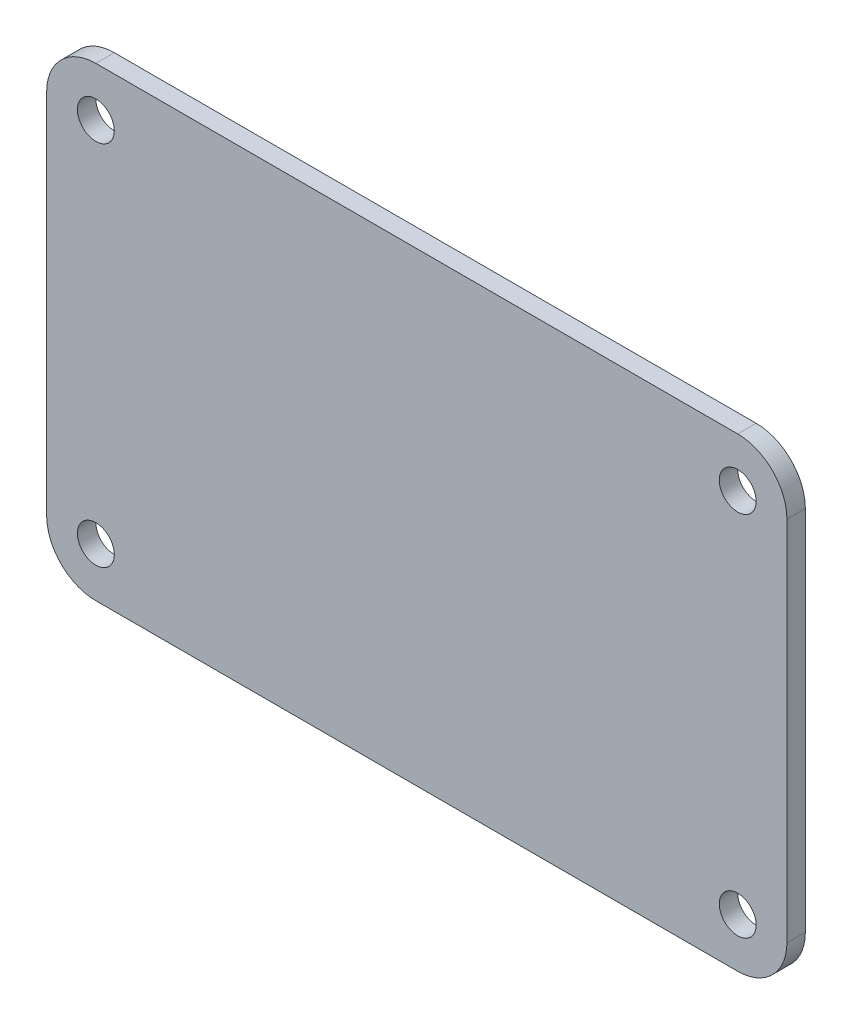
ISO-10303-21;
HEADER;
FILE_DESCRIPTION(('STEP AP214'),'2;1');
FILE_NAME('part.step','',(''),(''),'','','');
FILE_SCHEMA(('AUTOMOTIVE_DESIGN { 1 0 10303 214 1 1 1 1 }'));
ENDSEC;
DATA;
#1=APPLICATION_CONTEXT('core data for automotive mechanical design processes');
#2=APPLICATION_PROTOCOL_DEFINITION('international standard','automotive_design',2000,#1);
#3=PRODUCT_CONTEXT('',#1,'mechanical');
#4=PRODUCT('Part','Part','',(#3));
#5=PRODUCT_RELATED_PRODUCT_CATEGORY('part','',(#4));
#6=PRODUCT_DEFINITION_FORMATION('','',#4);
#7=PRODUCT_DEFINITION_CONTEXT('part definition',#1,'design');
#8=PRODUCT_DEFINITION('design','',#6,#7);
#9=PRODUCT_DEFINITION_SHAPE('','',#8);
#10=(LENGTH_UNIT() NAMED_UNIT(*) SI_UNIT(.MILLI.,.METRE.));
#11=(NAMED_UNIT(*) PLANE_ANGLE_UNIT() SI_UNIT($,.RADIAN.));
#12=(NAMED_UNIT(*) SI_UNIT($,.STERADIAN.) SOLID_ANGLE_UNIT());
#13=UNCERTAINTY_MEASURE_WITH_UNIT(LENGTH_MEASURE(1.E-05),#10,'distance_accuracy_value','');
#14=(GEOMETRIC_REPRESENTATION_CONTEXT(3) GLOBAL_UNCERTAINTY_ASSIGNED_CONTEXT((#13)) GLOBAL_UNIT_ASSIGNED_CONTEXT((#10,
#11,#12)) REPRESENTATION_CONTEXT('',''));
#15=CARTESIAN_POINT('',(0.,0.,0.));
#16=DIRECTION('',(0.,0.,1.));
#17=DIRECTION('',(1.,0.,0.));
#18=AXIS2_PLACEMENT_3D('',#15,#16,#17);
#19=CARTESIAN_POINT('',(26.095,-14.92,1.5));
#20=DIRECTION('',(0.,0.,1.));
#21=DIRECTION('',(1.,0.,0.));
#22=AXIS2_PLACEMENT_3D('',#19,#20,#21);
#23=PLANE('',#22);
#24=CARTESIAN_POINT('',(26.095,14.92,1.5));
#25=DIRECTION('',(0.,0.,1.));
#26=DIRECTION('',(1.,0.,0.));
#27=AXIS2_PLACEMENT_3D('',#24,#25,#26);
#28=CIRCLE('',#27,1.5);
#29=CARTESIAN_POINT('',(27.595,14.92,1.5));
#30=VERTEX_POINT('',#29);
#31=EDGE_CURVE('E188',#30,#30,#28,.T.);
#32=ORIENTED_EDGE('',*,*,#31,.F.);
#33=EDGE_LOOP('',(#32));
#34=FACE_BOUND('',#33,.T.);
#35=CARTESIAN_POINT('',(-26.095,14.92,1.5));
#36=DIRECTION('',(0.,0.,1.));
#37=DIRECTION('',(1.,0.,0.));
#38=AXIS2_PLACEMENT_3D('',#35,#36,#37);
#39=CIRCLE('',#38,1.5);
#40=CARTESIAN_POINT('',(-24.595,14.92,1.5));
#41=VERTEX_POINT('',#40);
#42=EDGE_CURVE('E134',#41,#41,#39,.T.);
#43=ORIENTED_EDGE('',*,*,#42,.F.);
#44=EDGE_LOOP('',(#43));
#45=FACE_BOUND('',#44,.T.);
#46=CARTESIAN_POINT('',(26.095,-14.92,1.5));
#47=DIRECTION('',(0.,0.,1.));
#48=DIRECTION('',(1.,0.,0.));
#49=AXIS2_PLACEMENT_3D('',#46,#47,#48);
#50=CIRCLE('',#49,4.);
#51=CARTESIAN_POINT('',(26.095,-18.92,1.5));
#52=VERTEX_POINT('',#51);
#53=CARTESIAN_POINT('',(30.095,-14.92,1.5));
#54=VERTEX_POINT('',#53);
#55=EDGE_CURVE('E145',#52,#54,#50,.T.);
#56=ORIENTED_EDGE('',*,*,#55,.T.);
#57=DIRECTION('',(0.,1.,0.));
#58=VECTOR('',#57,1.);
#59=CARTESIAN_POINT('',(30.095,14.92,1.5));
#60=LINE('',#59,#58);
#61=CARTESIAN_POINT('',(30.095,14.92,1.5));
#62=VERTEX_POINT('',#61);
#63=EDGE_CURVE('E93',#54,#62,#60,.T.);
#64=ORIENTED_EDGE('',*,*,#63,.T.);
#65=CARTESIAN_POINT('',(26.095,14.92,1.5));
#66=DIRECTION('',(0.,0.,1.));
#67=DIRECTION('',(-1.,0.,0.));
#68=AXIS2_PLACEMENT_3D('',#65,#66,#67);
#69=CIRCLE('',#68,4.);
#70=CARTESIAN_POINT('',(26.095,18.92,1.5));
#71=VERTEX_POINT('',#70);
#72=EDGE_CURVE('E160',#62,#71,#69,.T.);
#73=ORIENTED_EDGE('',*,*,#72,.T.);
#74=DIRECTION('',(-1.,0.,0.));
#75=VECTOR('',#74,1.);
#76=CARTESIAN_POINT('',(-26.095,18.92,1.5));
#77=LINE('',#76,#75);
#78=CARTESIAN_POINT('',(-26.095,18.92,1.5));
#79=VERTEX_POINT('',#78);
#80=EDGE_CURVE('E173',#71,#79,#77,.T.);
#81=ORIENTED_EDGE('',*,*,#80,.T.);
#82=CARTESIAN_POINT('',(-26.095,14.92,1.5));
#83=DIRECTION('',(0.,0.,1.));
#84=DIRECTION('',(1.,0.,0.));
#85=AXIS2_PLACEMENT_3D('',#82,#83,#84);
#86=CIRCLE('',#85,4.);
#87=CARTESIAN_POINT('',(-30.095,14.92,1.5));
#88=VERTEX_POINT('',#87);
#89=EDGE_CURVE('E112',#79,#88,#86,.T.);
#90=ORIENTED_EDGE('',*,*,#89,.T.);
#91=DIRECTION('',(0.,-1.,0.));
#92=VECTOR('',#91,1.);
#93=CARTESIAN_POINT('',(-30.095,14.92,1.5));
#94=LINE('',#93,#92);
#95=CARTESIAN_POINT('',(-30.095,-14.92,1.5));
#96=VERTEX_POINT('',#95);
#97=EDGE_CURVE('E106',#88,#96,#94,.T.);
#98=ORIENTED_EDGE('',*,*,#97,.T.);
#99=CARTESIAN_POINT('',(-26.095,-14.92,1.5));
#100=DIRECTION('',(0.,0.,1.));
#101=DIRECTION('',(1.,0.,0.));
#102=AXIS2_PLACEMENT_3D('',#99,#100,#101);
#103=CIRCLE('',#102,4.);
#104=CARTESIAN_POINT('',(-26.095,-18.92,1.5));
#105=VERTEX_POINT('',#104);
#106=EDGE_CURVE('E110',#96,#105,#103,.T.);
#107=ORIENTED_EDGE('',*,*,#106,.T.);
#108=DIRECTION('',(1.,0.,0.));
#109=VECTOR('',#108,1.);
#110=CARTESIAN_POINT('',(-26.095,-18.92,1.5));
#111=LINE('',#110,#109);
#112=EDGE_CURVE('E50',#105,#52,#111,.T.);
#113=ORIENTED_EDGE('',*,*,#112,.T.);
#114=EDGE_LOOP('',(#56,#64,#73,#81,#90,#98,#107,#113));
#115=FACE_BOUND('',#114,.T.);
#116=CARTESIAN_POINT('',(-26.095,-14.92,1.5));
#117=DIRECTION('',(0.,0.,1.));
#118=DIRECTION('',(1.,0.,0.));
#119=AXIS2_PLACEMENT_3D('',#116,#117,#118);
#120=CIRCLE('',#119,1.5);
#121=CARTESIAN_POINT('',(-24.595,-14.92,1.5));
#122=VERTEX_POINT('',#121);
#123=EDGE_CURVE('E182',#122,#122,#120,.T.);
#124=ORIENTED_EDGE('',*,*,#123,.F.);
#125=EDGE_LOOP('',(#124));
#126=FACE_BOUND('',#125,.T.);
#127=CARTESIAN_POINT('',(26.095,-14.92,1.5));
#128=DIRECTION('',(0.,0.,1.));
#129=DIRECTION('',(1.,0.,0.));
#130=AXIS2_PLACEMENT_3D('',#127,#128,#129);
#131=CIRCLE('',#130,1.5);
#132=CARTESIAN_POINT('',(27.595,-14.92,1.5));
#133=VERTEX_POINT('',#132);
#134=EDGE_CURVE('E194',#133,#133,#131,.T.);
#135=ORIENTED_EDGE('',*,*,#134,.F.);
#136=EDGE_LOOP('',(#135));
#137=FACE_BOUND('',#136,.T.);
#138=ADVANCED_FACE('F33',(#34,#45,#115,#126,#137),#23,.T.);
#139=CARTESIAN_POINT('',(26.095,-14.92,0.));
#140=DIRECTION('',(0.,0.,1.));
#141=DIRECTION('',(1.,0.,0.));
#142=AXIS2_PLACEMENT_3D('',#139,#140,#141);
#143=PLANE('',#142);
#144=CARTESIAN_POINT('',(26.095,-14.92,0.));
#145=DIRECTION('',(0.,0.,1.));
#146=DIRECTION('',(1.,0.,0.));
#147=AXIS2_PLACEMENT_3D('',#144,#145,#146);
#148=CIRCLE('',#147,4.);
#149=CARTESIAN_POINT('',(26.095,-18.92,0.));
#150=VERTEX_POINT('',#149);
#151=CARTESIAN_POINT('',(30.095,-14.92,0.));
#152=VERTEX_POINT('',#151);
#153=EDGE_CURVE('E130',#150,#152,#148,.T.);
#154=ORIENTED_EDGE('',*,*,#153,.F.);
#155=DIRECTION('',(1.,0.,0.));
#156=VECTOR('',#155,1.);
#157=CARTESIAN_POINT('',(-26.095,-18.92,0.));
#158=LINE('',#157,#156);
#159=CARTESIAN_POINT('',(-26.095,-18.92,0.));
#160=VERTEX_POINT('',#159);
#161=EDGE_CURVE('E85',#160,#150,#158,.T.);
#162=ORIENTED_EDGE('',*,*,#161,.F.);
#163=CARTESIAN_POINT('',(-26.095,-14.92,0.));
#164=DIRECTION('',(0.,0.,1.));
#165=DIRECTION('',(1.,0.,0.));
#166=AXIS2_PLACEMENT_3D('',#163,#164,#165);
#167=CIRCLE('',#166,4.);
#168=CARTESIAN_POINT('',(-30.095,-14.92,0.));
#169=VERTEX_POINT('',#168);
#170=EDGE_CURVE('E79',#169,#160,#167,.T.);
#171=ORIENTED_EDGE('',*,*,#170,.F.);
#172=DIRECTION('',(0.,-1.,0.));
#173=VECTOR('',#172,1.);
#174=CARTESIAN_POINT('',(-30.095,14.92,0.));
#175=LINE('',#174,#173);
#176=CARTESIAN_POINT('',(-30.095,14.92,0.));
#177=VERTEX_POINT('',#176);
#178=EDGE_CURVE('E120',#177,#169,#175,.T.);
#179=ORIENTED_EDGE('',*,*,#178,.F.);
#180=CARTESIAN_POINT('',(-26.095,14.92,0.));
#181=DIRECTION('',(0.,0.,1.));
#182=DIRECTION('',(1.,0.,0.));
#183=AXIS2_PLACEMENT_3D('',#180,#181,#182);
#184=CIRCLE('',#183,4.);
#185=CARTESIAN_POINT('',(-26.095,18.92,0.));
#186=VERTEX_POINT('',#185);
#187=EDGE_CURVE('E140',#186,#177,#184,.T.);
#188=ORIENTED_EDGE('',*,*,#187,.F.);
#189=DIRECTION('',(-1.,0.,0.));
#190=VECTOR('',#189,1.);
#191=CARTESIAN_POINT('',(-26.095,18.92,0.));
#192=LINE('',#191,#190);
#193=CARTESIAN_POINT('',(26.095,18.92,0.));
#194=VERTEX_POINT('',#193);
#195=EDGE_CURVE('E138',#194,#186,#192,.T.);
#196=ORIENTED_EDGE('',*,*,#195,.F.);
#197=CARTESIAN_POINT('',(26.095,14.92,0.));
#198=DIRECTION('',(0.,0.,1.));
#199=DIRECTION('',(-1.,0.,0.));
#200=AXIS2_PLACEMENT_3D('',#197,#198,#199);
#201=CIRCLE('',#200,4.);
#202=CARTESIAN_POINT('',(30.095,14.92,0.));
#203=VERTEX_POINT('',#202);
#204=EDGE_CURVE('E136',#203,#194,#201,.T.);
#205=ORIENTED_EDGE('',*,*,#204,.F.);
#206=DIRECTION('',(0.,1.,0.));
#207=VECTOR('',#206,1.);
#208=CARTESIAN_POINT('',(30.095,14.92,0.));
#209=LINE('',#208,#207);
#210=EDGE_CURVE('E133',#152,#203,#209,.T.);
#211=ORIENTED_EDGE('',*,*,#210,.F.);
#212=EDGE_LOOP('',(#154,#162,#171,#179,#188,#196,#205,#211));
#213=FACE_BOUND('',#212,.T.);
#214=CARTESIAN_POINT('',(-26.095,14.92,0.));
#215=DIRECTION('',(0.,0.,1.));
#216=DIRECTION('',(1.,0.,0.));
#217=AXIS2_PLACEMENT_3D('',#214,#215,#216);
#218=CIRCLE('',#217,1.5);
#219=CARTESIAN_POINT('',(-24.595,14.92,0.));
#220=VERTEX_POINT('',#219);
#221=EDGE_CURVE('E179',#220,#220,#218,.T.);
#222=ORIENTED_EDGE('',*,*,#221,.T.);
#223=EDGE_LOOP('',(#222));
#224=FACE_BOUND('',#223,.T.);
#225=CARTESIAN_POINT('',(-26.095,-14.92,0.));
#226=DIRECTION('',(0.,0.,1.));
#227=DIRECTION('',(1.,0.,0.));
#228=AXIS2_PLACEMENT_3D('',#225,#226,#227);
#229=CIRCLE('',#228,1.5);
#230=CARTESIAN_POINT('',(-24.595,-14.92,0.));
#231=VERTEX_POINT('',#230);
#232=EDGE_CURVE('E185',#231,#231,#229,.T.);
#233=ORIENTED_EDGE('',*,*,#232,.T.);
#234=EDGE_LOOP('',(#233));
#235=FACE_BOUND('',#234,.T.);
#236=CARTESIAN_POINT('',(26.095,14.92,0.));
#237=DIRECTION('',(0.,0.,1.));
#238=DIRECTION('',(1.,0.,0.));
#239=AXIS2_PLACEMENT_3D('',#236,#237,#238);
#240=CIRCLE('',#239,1.5);
#241=CARTESIAN_POINT('',(27.595,14.92,0.));
#242=VERTEX_POINT('',#241);
#243=EDGE_CURVE('E191',#242,#242,#240,.T.);
#244=ORIENTED_EDGE('',*,*,#243,.T.);
#245=EDGE_LOOP('',(#244));
#246=FACE_BOUND('',#245,.T.);
#247=CARTESIAN_POINT('',(26.095,-14.92,0.));
#248=DIRECTION('',(0.,0.,1.));
#249=DIRECTION('',(1.,0.,0.));
#250=AXIS2_PLACEMENT_3D('',#247,#248,#249);
#251=CIRCLE('',#250,1.5);
#252=CARTESIAN_POINT('',(27.595,-14.92,0.));
#253=VERTEX_POINT('',#252);
#254=EDGE_CURVE('E197',#253,#253,#251,.T.);
#255=ORIENTED_EDGE('',*,*,#254,.T.);
#256=EDGE_LOOP('',(#255));
#257=FACE_BOUND('',#256,.T.);
#258=ADVANCED_FACE('F164',(#213,#224,#235,#246,#257),#143,.F.);
#259=CARTESIAN_POINT('',(26.095,-14.92,1.5));
#260=DIRECTION('',(0.,0.,-1.));
#261=DIRECTION('',(-1.,0.,0.));
#262=AXIS2_PLACEMENT_3D('',#259,#260,#261);
#263=CYLINDRICAL_SURFACE('',#262,4.);
#264=ORIENTED_EDGE('',*,*,#153,.T.);
#265=DIRECTION('',(0.,0.,-1.));
#266=VECTOR('',#265,1.);
#267=CARTESIAN_POINT('',(30.095,-14.92,1.5));
#268=LINE('',#267,#266);
#269=EDGE_CURVE('E11',#54,#152,#268,.T.);
#270=ORIENTED_EDGE('',*,*,#269,.F.);
#271=ORIENTED_EDGE('',*,*,#55,.F.);
#272=DIRECTION('',(0.,0.,-1.));
#273=VECTOR('',#272,1.);
#274=CARTESIAN_POINT('',(26.095,-18.92,1.5));
#275=LINE('',#274,#273);
#276=EDGE_CURVE('E126',#52,#150,#275,.T.);
#277=ORIENTED_EDGE('',*,*,#276,.T.);
#278=EDGE_LOOP('',(#264,#270,#271,#277));
#279=FACE_BOUND('',#278,.T.);
#280=ADVANCED_FACE('F35',(#279),#263,.T.);
#281=CARTESIAN_POINT('',(30.095,14.92,1.5));
#282=DIRECTION('',(-1.,0.,0.));
#283=DIRECTION('',(0.,0.,1.));
#284=AXIS2_PLACEMENT_3D('',#281,#282,#283);
#285=PLANE('',#284);
#286=ORIENTED_EDGE('',*,*,#210,.T.);
#287=DIRECTION('',(0.,0.,-1.));
#288=VECTOR('',#287,1.);
#289=CARTESIAN_POINT('',(30.095,14.92,1.5));
#290=LINE('',#289,#288);
#291=EDGE_CURVE('E42',#62,#203,#290,.T.);
#292=ORIENTED_EDGE('',*,*,#291,.F.);
#293=ORIENTED_EDGE('',*,*,#63,.F.);
#294=ORIENTED_EDGE('',*,*,#269,.T.);
#295=EDGE_LOOP('',(#286,#292,#293,#294));
#296=FACE_BOUND('',#295,.T.);
#297=ADVANCED_FACE('F231',(#296),#285,.F.);
#298=CARTESIAN_POINT('',(26.095,14.92,1.5));
#299=DIRECTION('',(0.,0.,-1.));
#300=DIRECTION('',(-1.,0.,0.));
#301=AXIS2_PLACEMENT_3D('',#298,#299,#300);
#302=CYLINDRICAL_SURFACE('',#301,4.);
#303=ORIENTED_EDGE('',*,*,#204,.T.);
#304=DIRECTION('',(0.,0.,-1.));
#305=VECTOR('',#304,1.);
#306=CARTESIAN_POINT('',(26.095,18.92,1.5));
#307=LINE('',#306,#305);
#308=EDGE_CURVE('E152',#71,#194,#307,.T.);
#309=ORIENTED_EDGE('',*,*,#308,.F.);
#310=ORIENTED_EDGE('',*,*,#72,.F.);
#311=ORIENTED_EDGE('',*,*,#291,.T.);
#312=EDGE_LOOP('',(#303,#309,#310,#311));
#313=FACE_BOUND('',#312,.T.);
#314=ADVANCED_FACE('F158',(#313),#302,.T.);
#315=CARTESIAN_POINT('',(-26.095,18.92,1.5));
#316=DIRECTION('',(0.,-1.,0.));
#317=DIRECTION('',(0.,0.,-1.));
#318=AXIS2_PLACEMENT_3D('',#315,#316,#317);
#319=PLANE('',#318);
#320=ORIENTED_EDGE('',*,*,#195,.T.);
#321=DIRECTION('',(0.,0.,-1.));
#322=VECTOR('',#321,1.);
#323=CARTESIAN_POINT('',(-26.095,18.92,1.5));
#324=LINE('',#323,#322);
#325=EDGE_CURVE('E149',#79,#186,#324,.T.);
#326=ORIENTED_EDGE('',*,*,#325,.F.);
#327=ORIENTED_EDGE('',*,*,#80,.F.);
#328=ORIENTED_EDGE('',*,*,#308,.T.);
#329=EDGE_LOOP('',(#320,#326,#327,#328));
#330=FACE_BOUND('',#329,.T.);
#331=ADVANCED_FACE('F169',(#330),#319,.F.);
#332=CARTESIAN_POINT('',(-26.095,14.92,1.5));
#333=DIRECTION('',(0.,0.,-1.));
#334=DIRECTION('',(-1.,0.,0.));
#335=AXIS2_PLACEMENT_3D('',#332,#333,#334);
#336=CYLINDRICAL_SURFACE('',#335,4.);
#337=ORIENTED_EDGE('',*,*,#187,.T.);
#338=DIRECTION('',(0.,0.,-1.));
#339=VECTOR('',#338,1.);
#340=CARTESIAN_POINT('',(-30.095,14.92,1.5));
#341=LINE('',#340,#339);
#342=EDGE_CURVE('E121',#88,#177,#341,.T.);
#343=ORIENTED_EDGE('',*,*,#342,.F.);
#344=ORIENTED_EDGE('',*,*,#89,.F.);
#345=ORIENTED_EDGE('',*,*,#325,.T.);
#346=EDGE_LOOP('',(#337,#343,#344,#345));
#347=FACE_BOUND('',#346,.T.);
#348=ADVANCED_FACE('F172',(#347),#336,.T.);
#349=CARTESIAN_POINT('',(-30.095,14.92,1.5));
#350=DIRECTION('',(1.,0.,0.));
#351=DIRECTION('',(0.,1.,0.));
#352=AXIS2_PLACEMENT_3D('',#349,#350,#351);
#353=PLANE('',#352);
#354=ORIENTED_EDGE('',*,*,#178,.T.);
#355=DIRECTION('',(0.,0.,-1.));
#356=VECTOR('',#355,1.);
#357=CARTESIAN_POINT('',(-30.095,-14.92,1.5));
#358=LINE('',#357,#356);
#359=EDGE_CURVE('E117',#96,#169,#358,.T.);
#360=ORIENTED_EDGE('',*,*,#359,.F.);
#361=ORIENTED_EDGE('',*,*,#97,.F.);
#362=ORIENTED_EDGE('',*,*,#342,.T.);
#363=EDGE_LOOP('',(#354,#360,#361,#362));
#364=FACE_BOUND('',#363,.T.);
#365=ADVANCED_FACE('F118',(#364),#353,.F.);
#366=CARTESIAN_POINT('',(-26.095,-14.92,1.5));
#367=DIRECTION('',(0.,0.,-1.));
#368=DIRECTION('',(-1.,0.,0.));
#369=AXIS2_PLACEMENT_3D('',#366,#367,#368);
#370=CYLINDRICAL_SURFACE('',#369,4.);
#371=ORIENTED_EDGE('',*,*,#170,.T.);
#372=DIRECTION('',(0.,0.,-1.));
#373=VECTOR('',#372,1.);
#374=CARTESIAN_POINT('',(-26.095,-18.92,1.5));
#375=LINE('',#374,#373);
#376=EDGE_CURVE('E122',#105,#160,#375,.T.);
#377=ORIENTED_EDGE('',*,*,#376,.F.);
#378=ORIENTED_EDGE('',*,*,#106,.F.);
#379=ORIENTED_EDGE('',*,*,#359,.T.);
#380=EDGE_LOOP('',(#371,#377,#378,#379));
#381=FACE_BOUND('',#380,.T.);
#382=ADVANCED_FACE('F124',(#381),#370,.T.);
#383=CARTESIAN_POINT('',(-26.095,-18.92,1.5));
#384=DIRECTION('',(0.,1.,0.));
#385=DIRECTION('',(0.,0.,1.));
#386=AXIS2_PLACEMENT_3D('',#383,#384,#385);
#387=PLANE('',#386);
#388=ORIENTED_EDGE('',*,*,#161,.T.);
#389=ORIENTED_EDGE('',*,*,#276,.F.);
#390=ORIENTED_EDGE('',*,*,#112,.F.);
#391=ORIENTED_EDGE('',*,*,#376,.T.);
#392=EDGE_LOOP('',(#388,#389,#390,#391));
#393=FACE_BOUND('',#392,.T.);
#394=ADVANCED_FACE('F219',(#393),#387,.F.);
#395=CARTESIAN_POINT('',(-26.095,14.92,1.5));
#396=DIRECTION('',(0.,0.,-1.));
#397=DIRECTION('',(-1.,0.,0.));
#398=AXIS2_PLACEMENT_3D('',#395,#396,#397);
#399=CYLINDRICAL_SURFACE('',#398,1.5);
#400=ORIENTED_EDGE('',*,*,#42,.T.);
#401=EDGE_LOOP('',(#400));
#402=FACE_BOUND('',#401,.T.);
#403=ORIENTED_EDGE('',*,*,#221,.F.);
#404=EDGE_LOOP('',(#403));
#405=FACE_BOUND('',#404,.T.);
#406=ADVANCED_FACE('F216',(#402,#405),#399,.F.);
#407=CARTESIAN_POINT('',(-26.095,-14.92,1.5));
#408=DIRECTION('',(0.,0.,-1.));
#409=DIRECTION('',(-1.,0.,0.));
#410=AXIS2_PLACEMENT_3D('',#407,#408,#409);
#411=CYLINDRICAL_SURFACE('',#410,1.5);
#412=ORIENTED_EDGE('',*,*,#123,.T.);
#413=EDGE_LOOP('',(#412));
#414=FACE_BOUND('',#413,.T.);
#415=ORIENTED_EDGE('',*,*,#232,.F.);
#416=EDGE_LOOP('',(#415));
#417=FACE_BOUND('',#416,.T.);
#418=ADVANCED_FACE('F295',(#414,#417),#411,.F.);
#419=CARTESIAN_POINT('',(26.095,14.92,1.5));
#420=DIRECTION('',(0.,0.,-1.));
#421=DIRECTION('',(-1.,0.,0.));
#422=AXIS2_PLACEMENT_3D('',#419,#420,#421);
#423=CYLINDRICAL_SURFACE('',#422,1.5);
#424=ORIENTED_EDGE('',*,*,#31,.T.);
#425=EDGE_LOOP('',(#424));
#426=FACE_BOUND('',#425,.T.);
#427=ORIENTED_EDGE('',*,*,#243,.F.);
#428=EDGE_LOOP('',(#427));
#429=FACE_BOUND('',#428,.T.);
#430=ADVANCED_FACE('F303',(#426,#429),#423,.F.);
#431=CARTESIAN_POINT('',(26.095,-14.92,1.5));
#432=DIRECTION('',(0.,0.,-1.));
#433=DIRECTION('',(-1.,0.,0.));
#434=AXIS2_PLACEMENT_3D('',#431,#432,#433);
#435=CYLINDRICAL_SURFACE('',#434,1.5);
#436=ORIENTED_EDGE('',*,*,#134,.T.);
#437=EDGE_LOOP('',(#436));
#438=FACE_BOUND('',#437,.T.);
#439=ORIENTED_EDGE('',*,*,#254,.F.);
#440=EDGE_LOOP('',(#439));
#441=FACE_BOUND('',#440,.T.);
#442=ADVANCED_FACE('F203',(#438,#441),#435,.F.);
#443=CLOSED_SHELL('',(#138,#258,#280,#297,#314,#331,#348,#365,#382,#394,#406,#418,#430,#442));
#444=MANIFOLD_SOLID_BREP('B2',#443);
#445=ADVANCED_BREP_SHAPE_REPRESENTATION('',(#18,#444),#14);
#446=SHAPE_DEFINITION_REPRESENTATION(#9,#445);
ENDSEC;
END-ISO-10303-21;
